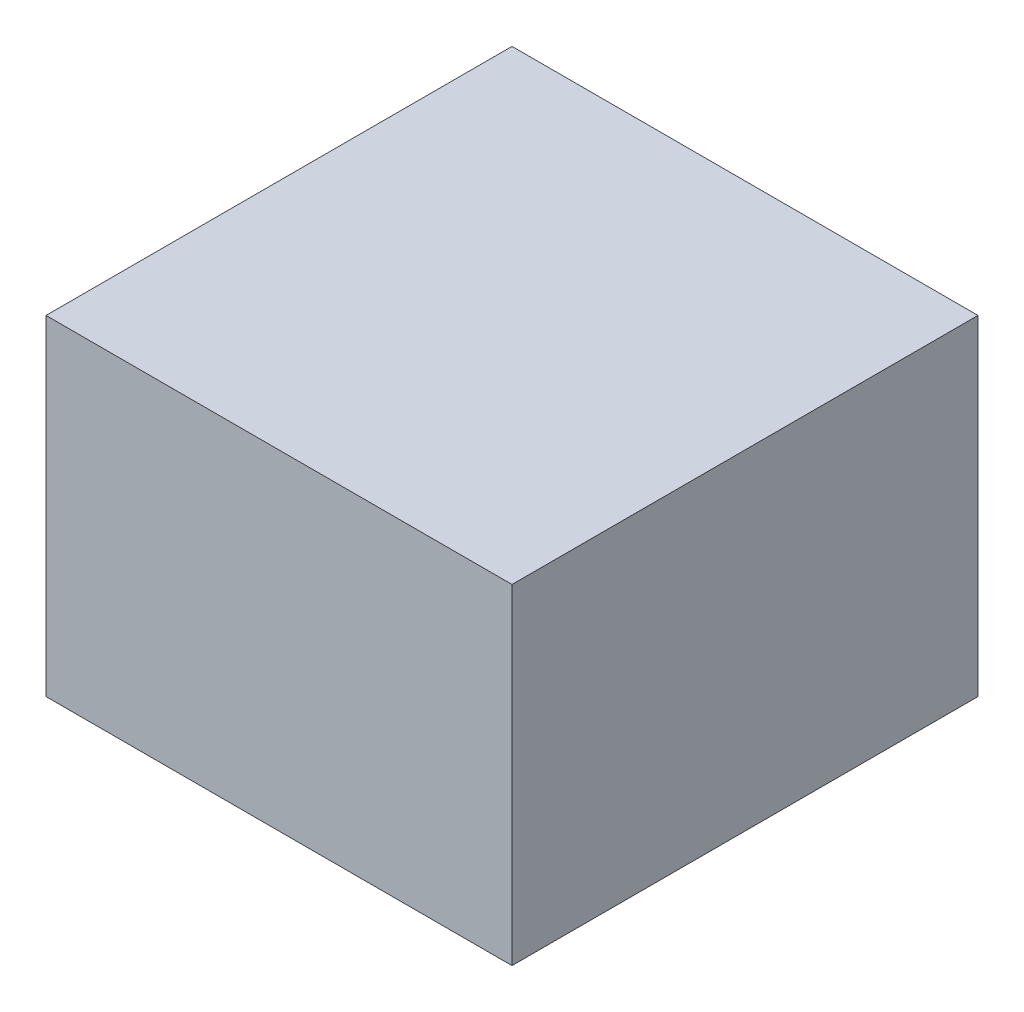
ISO-10303-21;
HEADER;
FILE_DESCRIPTION(('STEP AP214'),'2;1');
FILE_NAME('part.step','',(''),(''),'','','');
FILE_SCHEMA(('AUTOMOTIVE_DESIGN { 1 0 10303 214 1 1 1 1 }'));
ENDSEC;
DATA;
#1=APPLICATION_CONTEXT('core data for automotive mechanical design processes');
#2=APPLICATION_PROTOCOL_DEFINITION('international standard','automotive_design',2000,#1);
#3=PRODUCT_CONTEXT('',#1,'mechanical');
#4=PRODUCT('Part','Part','',(#3));
#5=PRODUCT_RELATED_PRODUCT_CATEGORY('part','',(#4));
#6=PRODUCT_DEFINITION_FORMATION('','',#4);
#7=PRODUCT_DEFINITION_CONTEXT('part definition',#1,'design');
#8=PRODUCT_DEFINITION('design','',#6,#7);
#9=PRODUCT_DEFINITION_SHAPE('','',#8);
#10=(LENGTH_UNIT() NAMED_UNIT(*) SI_UNIT(.MILLI.,.METRE.));
#11=(NAMED_UNIT(*) PLANE_ANGLE_UNIT() SI_UNIT($,.RADIAN.));
#12=(NAMED_UNIT(*) SI_UNIT($,.STERADIAN.) SOLID_ANGLE_UNIT());
#13=UNCERTAINTY_MEASURE_WITH_UNIT(LENGTH_MEASURE(1.E-05),#10,'distance_accuracy_value','');
#14=(GEOMETRIC_REPRESENTATION_CONTEXT(3) GLOBAL_UNCERTAINTY_ASSIGNED_CONTEXT((#13)) GLOBAL_UNIT_ASSIGNED_CONTEXT((#10,
#11,#12)) REPRESENTATION_CONTEXT('',''));
#15=CARTESIAN_POINT('',(0.,0.,0.));
#16=DIRECTION('',(0.,0.,1.));
#17=DIRECTION('',(1.,0.,0.));
#18=AXIS2_PLACEMENT_3D('',#15,#16,#17);
#19=CARTESIAN_POINT('',(30.48,-21.59,60.96));
#20=DIRECTION('',(-1.,0.,0.));
#21=DIRECTION('',(0.,-1.,0.));
#22=AXIS2_PLACEMENT_3D('',#19,#20,#21);
#23=PLANE('',#22);
#24=DIRECTION('',(0.,1.,0.));
#25=VECTOR('',#24,1.);
#26=CARTESIAN_POINT('',(30.48,-21.59,0.));
#27=LINE('',#26,#25);
#28=CARTESIAN_POINT('',(30.48,-21.59,0.));
#29=VERTEX_POINT('',#28);
#30=CARTESIAN_POINT('',(30.48,21.59,0.));
#31=VERTEX_POINT('',#30);
#32=EDGE_CURVE('E104',#29,#31,#27,.T.);
#33=ORIENTED_EDGE('',*,*,#32,.T.);
#34=DIRECTION('',(0.,0.,-1.));
#35=VECTOR('',#34,1.);
#36=CARTESIAN_POINT('',(30.48,21.59,60.96));
#37=LINE('',#36,#35);
#38=CARTESIAN_POINT('',(30.48,21.59,60.96));
#39=VERTEX_POINT('',#38);
#40=EDGE_CURVE('E11',#39,#31,#37,.T.);
#41=ORIENTED_EDGE('',*,*,#40,.F.);
#42=DIRECTION('',(0.,1.,0.));
#43=VECTOR('',#42,1.);
#44=CARTESIAN_POINT('',(30.48,-21.59,60.96));
#45=LINE('',#44,#43);
#46=CARTESIAN_POINT('',(30.48,-21.59,60.96));
#47=VERTEX_POINT('',#46);
#48=EDGE_CURVE('E92',#47,#39,#45,.T.);
#49=ORIENTED_EDGE('',*,*,#48,.F.);
#50=DIRECTION('',(0.,0.,-1.));
#51=VECTOR('',#50,1.);
#52=CARTESIAN_POINT('',(30.48,-21.59,60.96));
#53=LINE('',#52,#51);
#54=EDGE_CURVE('E100',#47,#29,#53,.T.);
#55=ORIENTED_EDGE('',*,*,#54,.T.);
#56=EDGE_LOOP('',(#33,#41,#49,#55));
#57=FACE_BOUND('',#56,.T.);
#58=ADVANCED_FACE('F41',(#57),#23,.F.);
#59=CARTESIAN_POINT('',(-30.48,21.59,60.96));
#60=DIRECTION('',(0.,-1.,0.));
#61=DIRECTION('',(0.,0.,-1.));
#62=AXIS2_PLACEMENT_3D('',#59,#60,#61);
#63=PLANE('',#62);
#64=DIRECTION('',(-1.,0.,0.));
#65=VECTOR('',#64,1.);
#66=CARTESIAN_POINT('',(-30.48,21.59,0.));
#67=LINE('',#66,#65);
#68=CARTESIAN_POINT('',(-30.48,21.59,0.));
#69=VERTEX_POINT('',#68);
#70=EDGE_CURVE('E96',#31,#69,#67,.T.);
#71=ORIENTED_EDGE('',*,*,#70,.T.);
#72=DIRECTION('',(0.,0.,-1.));
#73=VECTOR('',#72,1.);
#74=CARTESIAN_POINT('',(-30.48,21.59,60.96));
#75=LINE('',#74,#73);
#76=CARTESIAN_POINT('',(-30.48,21.59,60.96));
#77=VERTEX_POINT('',#76);
#78=EDGE_CURVE('E49',#77,#69,#75,.T.);
#79=ORIENTED_EDGE('',*,*,#78,.F.);
#80=DIRECTION('',(-1.,0.,0.));
#81=VECTOR('',#80,1.);
#82=CARTESIAN_POINT('',(-30.48,21.59,60.96));
#83=LINE('',#82,#81);
#84=EDGE_CURVE('E87',#39,#77,#83,.T.);
#85=ORIENTED_EDGE('',*,*,#84,.F.);
#86=ORIENTED_EDGE('',*,*,#40,.T.);
#87=EDGE_LOOP('',(#71,#79,#85,#86));
#88=FACE_BOUND('',#87,.T.);
#89=ADVANCED_FACE('F95',(#88),#63,.F.);
#90=CARTESIAN_POINT('',(-30.48,-21.59,60.96));
#91=DIRECTION('',(1.,0.,0.));
#92=DIRECTION('',(0.,0.,-1.));
#93=AXIS2_PLACEMENT_3D('',#90,#91,#92);
#94=PLANE('',#93);
#95=DIRECTION('',(0.,-1.,0.));
#96=VECTOR('',#95,1.);
#97=CARTESIAN_POINT('',(-30.48,-21.59,0.));
#98=LINE('',#97,#96);
#99=CARTESIAN_POINT('',(-30.48,-21.59,0.));
#100=VERTEX_POINT('',#99);
#101=EDGE_CURVE('E74',#69,#100,#98,.T.);
#102=ORIENTED_EDGE('',*,*,#101,.T.);
#103=DIRECTION('',(0.,0.,-1.));
#104=VECTOR('',#103,1.);
#105=CARTESIAN_POINT('',(-30.48,-21.59,60.96));
#106=LINE('',#105,#104);
#107=CARTESIAN_POINT('',(-30.48,-21.59,60.96));
#108=VERTEX_POINT('',#107);
#109=EDGE_CURVE('E97',#108,#100,#106,.T.);
#110=ORIENTED_EDGE('',*,*,#109,.F.);
#111=DIRECTION('',(0.,-1.,0.));
#112=VECTOR('',#111,1.);
#113=CARTESIAN_POINT('',(-30.48,-21.59,60.96));
#114=LINE('',#113,#112);
#115=EDGE_CURVE('E90',#77,#108,#114,.T.);
#116=ORIENTED_EDGE('',*,*,#115,.F.);
#117=ORIENTED_EDGE('',*,*,#78,.T.);
#118=EDGE_LOOP('',(#102,#110,#116,#117));
#119=FACE_BOUND('',#118,.T.);
#120=ADVANCED_FACE('F98',(#119),#94,.F.);
#121=CARTESIAN_POINT('',(-30.48,-21.59,60.96));
#122=DIRECTION('',(0.,1.,0.));
#123=DIRECTION('',(0.,0.,1.));
#124=AXIS2_PLACEMENT_3D('',#121,#122,#123);
#125=PLANE('',#124);
#126=DIRECTION('',(1.,0.,0.));
#127=VECTOR('',#126,1.);
#128=CARTESIAN_POINT('',(-30.48,-21.59,0.));
#129=LINE('',#128,#127);
#130=EDGE_CURVE('E80',#100,#29,#129,.T.);
#131=ORIENTED_EDGE('',*,*,#130,.T.);
#132=ORIENTED_EDGE('',*,*,#54,.F.);
#133=DIRECTION('',(1.,0.,0.));
#134=VECTOR('',#133,1.);
#135=CARTESIAN_POINT('',(-30.48,-21.59,60.96));
#136=LINE('',#135,#134);
#137=EDGE_CURVE('E57',#108,#47,#136,.T.);
#138=ORIENTED_EDGE('',*,*,#137,.F.);
#139=ORIENTED_EDGE('',*,*,#109,.T.);
#140=EDGE_LOOP('',(#131,#132,#138,#139));
#141=FACE_BOUND('',#140,.T.);
#142=ADVANCED_FACE('F111',(#141),#125,.F.);
#143=CARTESIAN_POINT('',(0.,0.,60.96));
#144=DIRECTION('',(0.,0.,-1.));
#145=DIRECTION('',(-1.,0.,0.));
#146=AXIS2_PLACEMENT_3D('',#143,#144,#145);
#147=PLANE('',#146);
#148=ORIENTED_EDGE('',*,*,#48,.T.);
#149=ORIENTED_EDGE('',*,*,#84,.T.);
#150=ORIENTED_EDGE('',*,*,#115,.T.);
#151=ORIENTED_EDGE('',*,*,#137,.T.);
#152=EDGE_LOOP('',(#148,#149,#150,#151));
#153=FACE_BOUND('',#152,.T.);
#154=ADVANCED_FACE('F88',(#153),#147,.F.);
#155=CARTESIAN_POINT('',(0.,0.,0.));
#156=DIRECTION('',(0.,0.,-1.));
#157=DIRECTION('',(-1.,0.,0.));
#158=AXIS2_PLACEMENT_3D('',#155,#156,#157);
#159=PLANE('',#158);
#160=ORIENTED_EDGE('',*,*,#32,.F.);
#161=ORIENTED_EDGE('',*,*,#130,.F.);
#162=ORIENTED_EDGE('',*,*,#101,.F.);
#163=ORIENTED_EDGE('',*,*,#70,.F.);
#164=EDGE_LOOP('',(#160,#161,#162,#163));
#165=FACE_BOUND('',#164,.T.);
#166=ADVANCED_FACE('F114',(#165),#159,.T.);
#167=CLOSED_SHELL('',(#58,#89,#120,#142,#154,#166));
#168=MANIFOLD_SOLID_BREP('B2',#167);
#169=ADVANCED_BREP_SHAPE_REPRESENTATION('',(#18,#168),#14);
#170=SHAPE_DEFINITION_REPRESENTATION(#9,#169);
ENDSEC;
END-ISO-10303-21;
